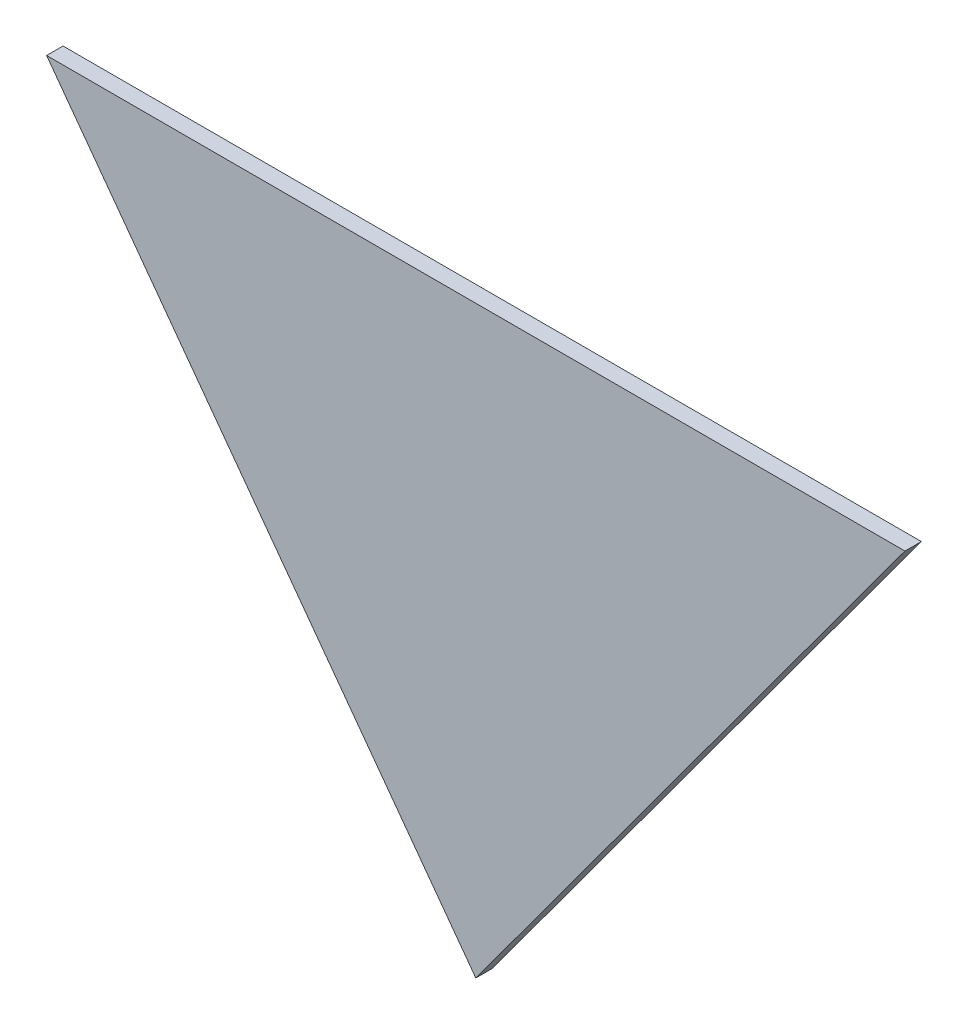
ISO-10303-21;
HEADER;
FILE_DESCRIPTION(('STEP AP214'),'2;1');
FILE_NAME('part.step','',(''),(''),'','','');
FILE_SCHEMA(('AUTOMOTIVE_DESIGN { 1 0 10303 214 1 1 1 1 }'));
ENDSEC;
DATA;
#1=APPLICATION_CONTEXT('core data for automotive mechanical design processes');
#2=APPLICATION_PROTOCOL_DEFINITION('international standard','automotive_design',2000,#1);
#3=PRODUCT_CONTEXT('',#1,'mechanical');
#4=PRODUCT('Part','Part','',(#3));
#5=PRODUCT_RELATED_PRODUCT_CATEGORY('part','',(#4));
#6=PRODUCT_DEFINITION_FORMATION('','',#4);
#7=PRODUCT_DEFINITION_CONTEXT('part definition',#1,'design');
#8=PRODUCT_DEFINITION('design','',#6,#7);
#9=PRODUCT_DEFINITION_SHAPE('','',#8);
#10=(LENGTH_UNIT() NAMED_UNIT(*) SI_UNIT(.MILLI.,.METRE.));
#11=(NAMED_UNIT(*) PLANE_ANGLE_UNIT() SI_UNIT($,.RADIAN.));
#12=(NAMED_UNIT(*) SI_UNIT($,.STERADIAN.) SOLID_ANGLE_UNIT());
#13=UNCERTAINTY_MEASURE_WITH_UNIT(LENGTH_MEASURE(1.E-05),#10,'distance_accuracy_value','');
#14=(GEOMETRIC_REPRESENTATION_CONTEXT(3) GLOBAL_UNCERTAINTY_ASSIGNED_CONTEXT((#13)) GLOBAL_UNIT_ASSIGNED_CONTEXT((#10,
#11,#12)) REPRESENTATION_CONTEXT('',''));
#15=CARTESIAN_POINT('',(0.,0.,0.));
#16=DIRECTION('',(0.,0.,1.));
#17=DIRECTION('',(1.,0.,0.));
#18=AXIS2_PLACEMENT_3D('',#15,#16,#17);
#19=CARTESIAN_POINT('',(0.,3.414155140142,0.087));
#20=DIRECTION('',(0.,0.,1.));
#21=DIRECTION('',(1.,0.,0.));
#22=AXIS2_PLACEMENT_3D('',#19,#20,#21);
#23=PLANE('',#22);
#24=DIRECTION('',(-1.,0.,0.));
#25=VECTOR('',#24,1.);
#26=CARTESIAN_POINT('',(0.339860930276,3.559490122206,0.087));
#27=LINE('',#26,#25);
#28=CARTESIAN_POINT('',(0.339860930276,3.559490122206,0.087));
#29=VERTEX_POINT('',#28);
#30=CARTESIAN_POINT('',(-0.339860930276,3.559490122206,0.087));
#31=VERTEX_POINT('',#30);
#32=EDGE_CURVE('E20',#29,#31,#27,.T.);
#33=ORIENTED_EDGE('',*,*,#32,.F.);
#34=DIRECTION('',(0.591955733274022,0.80597047703003,0.));
#35=VECTOR('',#34,1.);
#36=CARTESIAN_POINT('',(0.,3.09675640632,0.087));
#37=LINE('',#36,#35);
#38=CARTESIAN_POINT('',(0.,3.09675640632,0.087));
#39=VERTEX_POINT('',#38);
#40=EDGE_CURVE('E78',#39,#29,#37,.T.);
#41=ORIENTED_EDGE('',*,*,#40,.F.);
#42=DIRECTION('',(0.591955733274022,-0.80597047703003,0.));
#43=VECTOR('',#42,1.);
#44=CARTESIAN_POINT('',(-0.339860930276,3.559490122206,0.087));
#45=LINE('',#44,#43);
#46=EDGE_CURVE('E62',#31,#39,#45,.T.);
#47=ORIENTED_EDGE('',*,*,#46,.F.);
#48=EDGE_LOOP('',(#33,#41,#47));
#49=FACE_BOUND('',#48,.T.);
#50=ADVANCED_FACE('F17',(#49),#23,.F.);
#51=CARTESIAN_POINT('',(0.,3.414155140142,0.1));
#52=DIRECTION('',(0.,0.,1.));
#53=DIRECTION('',(1.,0.,0.));
#54=AXIS2_PLACEMENT_3D('',#51,#52,#53);
#55=PLANE('',#54);
#56=DIRECTION('',(-1.,0.,0.));
#57=VECTOR('',#56,1.);
#58=CARTESIAN_POINT('',(0.339860930276,3.559490122206,0.1));
#59=LINE('',#58,#57);
#60=CARTESIAN_POINT('',(0.339860930276,3.559490122206,0.1));
#61=VERTEX_POINT('',#60);
#62=CARTESIAN_POINT('',(-0.339860930276,3.559490122206,0.1));
#63=VERTEX_POINT('',#62);
#64=EDGE_CURVE('E11',#61,#63,#59,.T.);
#65=ORIENTED_EDGE('',*,*,#64,.T.);
#66=DIRECTION('',(0.591955733274022,-0.80597047703003,0.));
#67=VECTOR('',#66,1.);
#68=CARTESIAN_POINT('',(-0.339860930276,3.559490122206,0.1));
#69=LINE('',#68,#67);
#70=CARTESIAN_POINT('',(0.,3.09675640632,0.1));
#71=VERTEX_POINT('',#70);
#72=EDGE_CURVE('E72',#63,#71,#69,.T.);
#73=ORIENTED_EDGE('',*,*,#72,.T.);
#74=DIRECTION('',(0.591955733274022,0.80597047703003,0.));
#75=VECTOR('',#74,1.);
#76=CARTESIAN_POINT('',(0.,3.09675640632,0.1));
#77=LINE('',#76,#75);
#78=EDGE_CURVE('E79',#71,#61,#77,.T.);
#79=ORIENTED_EDGE('',*,*,#78,.T.);
#80=EDGE_LOOP('',(#65,#73,#79));
#81=FACE_BOUND('',#80,.T.);
#82=ADVANCED_FACE('F97',(#81),#55,.T.);
#83=CARTESIAN_POINT('',(0.339860930276,3.559490122206,0.087));
#84=DIRECTION('',(0.,1.,0.));
#85=DIRECTION('',(1.,0.,0.));
#86=AXIS2_PLACEMENT_3D('',#83,#84,#85);
#87=PLANE('',#86);
#88=ORIENTED_EDGE('',*,*,#32,.T.);
#89=DIRECTION('',(0.,0.,1.));
#90=VECTOR('',#89,1.);
#91=CARTESIAN_POINT('',(-0.339860930276,3.559490122206,0.087));
#92=LINE('',#91,#90);
#93=EDGE_CURVE('E68',#31,#63,#92,.T.);
#94=ORIENTED_EDGE('',*,*,#93,.T.);
#95=ORIENTED_EDGE('',*,*,#64,.F.);
#96=DIRECTION('',(0.,0.,1.));
#97=VECTOR('',#96,1.);
#98=CARTESIAN_POINT('',(0.339860930276,3.559490122206,0.087));
#99=LINE('',#98,#97);
#100=EDGE_CURVE('E83',#29,#61,#99,.T.);
#101=ORIENTED_EDGE('',*,*,#100,.F.);
#102=EDGE_LOOP('',(#88,#94,#95,#101));
#103=FACE_BOUND('',#102,.T.);
#104=ADVANCED_FACE('F98',(#103),#87,.T.);
#105=CARTESIAN_POINT('',(-0.339860930276,3.559490122206,0.087));
#106=DIRECTION('',(-0.80597047703003,-0.591955733274022,0.));
#107=DIRECTION('',(-0.591955733274022,0.80597047703003,0.));
#108=AXIS2_PLACEMENT_3D('',#105,#106,#107);
#109=PLANE('',#108);
#110=ORIENTED_EDGE('',*,*,#46,.T.);
#111=DIRECTION('',(0.,0.,1.));
#112=VECTOR('',#111,1.);
#113=CARTESIAN_POINT('',(0.,3.09675640632,0.087));
#114=LINE('',#113,#112);
#115=EDGE_CURVE('E66',#39,#71,#114,.T.);
#116=ORIENTED_EDGE('',*,*,#115,.T.);
#117=ORIENTED_EDGE('',*,*,#72,.F.);
#118=ORIENTED_EDGE('',*,*,#93,.F.);
#119=EDGE_LOOP('',(#110,#116,#117,#118));
#120=FACE_BOUND('',#119,.T.);
#121=ADVANCED_FACE('F64',(#120),#109,.T.);
#122=CARTESIAN_POINT('',(0.,3.09675640632,0.087));
#123=DIRECTION('',(0.80597047703003,-0.591955733274022,0.));
#124=DIRECTION('',(0.,0.,-1.));
#125=AXIS2_PLACEMENT_3D('',#122,#123,#124);
#126=PLANE('',#125);
#127=ORIENTED_EDGE('',*,*,#40,.T.);
#128=ORIENTED_EDGE('',*,*,#100,.T.);
#129=ORIENTED_EDGE('',*,*,#78,.F.);
#130=ORIENTED_EDGE('',*,*,#115,.F.);
#131=EDGE_LOOP('',(#127,#128,#129,#130));
#132=FACE_BOUND('',#131,.T.);
#133=ADVANCED_FACE('F76',(#132),#126,.T.);
#134=CLOSED_SHELL('',(#50,#82,#104,#121,#133));
#135=MANIFOLD_SOLID_BREP('B1',#134);
#136=ADVANCED_BREP_SHAPE_REPRESENTATION('',(#18,#135),#14);
#137=SHAPE_DEFINITION_REPRESENTATION(#9,#136);
ENDSEC;
END-ISO-10303-21;
